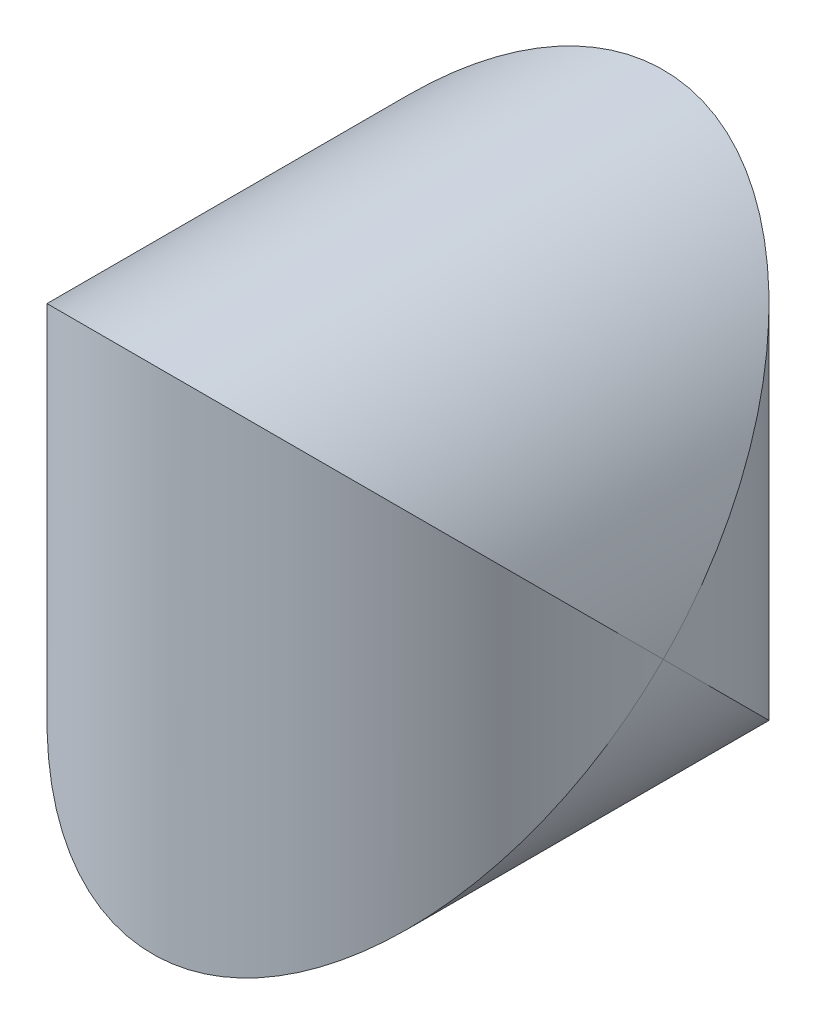
ISO-10303-21;
HEADER;
FILE_DESCRIPTION(('STEP AP214'),'2;1');
FILE_NAME('part.step','',(''),(''),'','','');
FILE_SCHEMA(('AUTOMOTIVE_DESIGN { 1 0 10303 214 1 1 1 1 }'));
ENDSEC;
DATA;
#1=APPLICATION_CONTEXT('core data for automotive mechanical design processes');
#2=APPLICATION_PROTOCOL_DEFINITION('international standard','automotive_design',2000,#1);
#3=PRODUCT_CONTEXT('',#1,'mechanical');
#4=PRODUCT('Part','Part','',(#3));
#5=PRODUCT_RELATED_PRODUCT_CATEGORY('part','',(#4));
#6=PRODUCT_DEFINITION_FORMATION('','',#4);
#7=PRODUCT_DEFINITION_CONTEXT('part definition',#1,'design');
#8=PRODUCT_DEFINITION('design','',#6,#7);
#9=PRODUCT_DEFINITION_SHAPE('','',#8);
#10=(LENGTH_UNIT() NAMED_UNIT(*) SI_UNIT(.MILLI.,.METRE.));
#11=(NAMED_UNIT(*) PLANE_ANGLE_UNIT() SI_UNIT($,.RADIAN.));
#12=(NAMED_UNIT(*) SI_UNIT($,.STERADIAN.) SOLID_ANGLE_UNIT());
#13=UNCERTAINTY_MEASURE_WITH_UNIT(LENGTH_MEASURE(1.E-05),#10,'distance_accuracy_value','');
#14=(GEOMETRIC_REPRESENTATION_CONTEXT(3) GLOBAL_UNCERTAINTY_ASSIGNED_CONTEXT((#13)) GLOBAL_UNIT_ASSIGNED_CONTEXT((#10,
#11,#12)) REPRESENTATION_CONTEXT('',''));
#15=CARTESIAN_POINT('',(0.,0.,0.));
#16=DIRECTION('',(0.,0.,1.));
#17=DIRECTION('',(1.,0.,0.));
#18=AXIS2_PLACEMENT_3D('',#15,#16,#17);
#19=CARTESIAN_POINT('',(0.,0.,15.));
#20=DIRECTION('',(0.,0.,-1.));
#21=DIRECTION('',(-1.,0.,0.));
#22=AXIS2_PLACEMENT_3D('',#19,#20,#21);
#23=CYLINDRICAL_SURFACE('',#22,15.);
#24=CARTESIAN_POINT('',(0.,0.,0.));
#25=DIRECTION('',(0.,0.707106781186547,-0.707106781186547));
#26=DIRECTION('',(0.,-0.707106781186547,-0.707106781186547));
#27=AXIS2_PLACEMENT_3D('',#24,#25,#26);
#28=ELLIPSE('',#27,21.2132034355964,15.);
#29=CARTESIAN_POINT('',(15.,0.,0.));
#30=VERTEX_POINT('',#29);
#31=CARTESIAN_POINT('',(-15.,0.,0.));
#32=VERTEX_POINT('',#31);
#33=EDGE_CURVE('E59',#30,#32,#28,.T.);
#34=ORIENTED_EDGE('',*,*,#33,.F.);
#35=CARTESIAN_POINT('',(0.,0.,0.));
#36=DIRECTION('',(0.,-0.707106781186547,-0.707106781186547));
#37=DIRECTION('',(0.,0.707106781186547,-0.707106781186547));
#38=AXIS2_PLACEMENT_3D('',#35,#36,#37);
#39=ELLIPSE('',#38,21.2132034355964,15.);
#40=EDGE_CURVE('E12',#32,#30,#39,.F.);
#41=ORIENTED_EDGE('',*,*,#40,.F.);
#42=EDGE_LOOP('',(#34,#41));
#43=FACE_BOUND('',#42,.T.);
#44=ADVANCED_FACE('F40',(#43),#23,.T.);
#45=CARTESIAN_POINT('',(0.,-15.,0.));
#46=DIRECTION('',(0.,1.,0.));
#47=DIRECTION('',(0.,0.,1.));
#48=AXIS2_PLACEMENT_3D('',#45,#46,#47);
#49=CYLINDRICAL_SURFACE('',#48,15.);
#50=ORIENTED_EDGE('',*,*,#40,.T.);
#51=CARTESIAN_POINT('',(0.,0.,0.));
#52=DIRECTION('',(0.,0.707106781186547,-0.707106781186547));
#53=DIRECTION('',(0.,-0.707106781186547,-0.707106781186547));
#54=AXIS2_PLACEMENT_3D('',#51,#52,#53);
#55=ELLIPSE('',#54,21.2132034355964,15.);
#56=EDGE_CURVE('E48',#30,#32,#55,.F.);
#57=ORIENTED_EDGE('',*,*,#56,.T.);
#58=EDGE_LOOP('',(#50,#57));
#59=FACE_BOUND('',#58,.T.);
#60=ADVANCED_FACE('F56',(#59),#49,.T.);
#61=CARTESIAN_POINT('',(0.,0.,0.));
#62=DIRECTION('',(0.,-0.707106781186547,-0.707106781186547));
#63=DIRECTION('',(0.,0.707106781186547,-0.707106781186547));
#64=AXIS2_PLACEMENT_3D('',#61,#62,#63);
#65=ELLIPSE('',#64,21.2132034355964,15.);
#66=EDGE_CURVE('E62',#32,#30,#65,.T.);
#67=ORIENTED_EDGE('',*,*,#66,.F.);
#68=ORIENTED_EDGE('',*,*,#56,.F.);
#69=EDGE_LOOP('',(#67,#68));
#70=FACE_BOUND('',#69,.T.);
#71=ADVANCED_FACE('F42',(#70),#23,.T.);
#72=ORIENTED_EDGE('',*,*,#33,.T.);
#73=ORIENTED_EDGE('',*,*,#66,.T.);
#74=EDGE_LOOP('',(#72,#73));
#75=FACE_BOUND('',#74,.T.);
#76=ADVANCED_FACE('F64',(#75),#49,.T.);
#77=CLOSED_SHELL('',(#44,#60,#71,#76));
#78=MANIFOLD_SOLID_BREP('B2',#77);
#79=ADVANCED_BREP_SHAPE_REPRESENTATION('',(#18,#78),#14);
#80=SHAPE_DEFINITION_REPRESENTATION(#9,#79);
ENDSEC;
END-ISO-10303-21;
